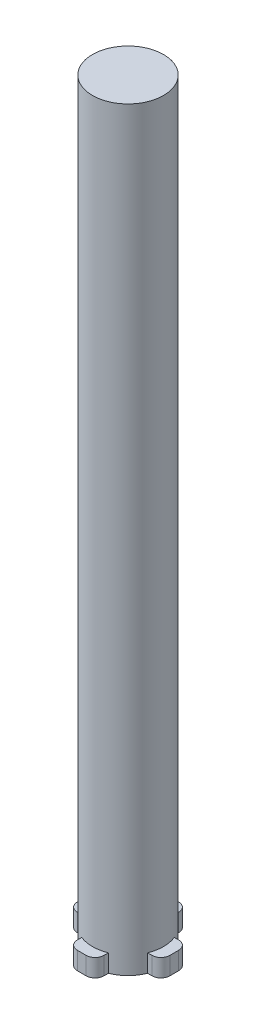
ISO-10303-21;
HEADER;
FILE_DESCRIPTION(('STEP AP214'),'2;1');
FILE_NAME('part.step','',(''),(''),'','','');
FILE_SCHEMA(('AUTOMOTIVE_DESIGN { 1 0 10303 214 1 1 1 1 }'));
ENDSEC;
DATA;
#1=APPLICATION_CONTEXT('core data for automotive mechanical design processes');
#2=APPLICATION_PROTOCOL_DEFINITION('international standard','automotive_design',2000,#1);
#3=PRODUCT_CONTEXT('',#1,'mechanical');
#4=PRODUCT('Part','Part','',(#3));
#5=PRODUCT_RELATED_PRODUCT_CATEGORY('part','',(#4));
#6=PRODUCT_DEFINITION_FORMATION('','',#4);
#7=PRODUCT_DEFINITION_CONTEXT('part definition',#1,'design');
#8=PRODUCT_DEFINITION('design','',#6,#7);
#9=PRODUCT_DEFINITION_SHAPE('','',#8);
#10=(LENGTH_UNIT() NAMED_UNIT(*) SI_UNIT(.MILLI.,.METRE.));
#11=(NAMED_UNIT(*) PLANE_ANGLE_UNIT() SI_UNIT($,.RADIAN.));
#12=(NAMED_UNIT(*) SI_UNIT($,.STERADIAN.) SOLID_ANGLE_UNIT());
#13=UNCERTAINTY_MEASURE_WITH_UNIT(LENGTH_MEASURE(1.E-05),#10,'distance_accuracy_value','');
#14=(GEOMETRIC_REPRESENTATION_CONTEXT(3) GLOBAL_UNCERTAINTY_ASSIGNED_CONTEXT((#13)) GLOBAL_UNIT_ASSIGNED_CONTEXT((#10,
#11,#12)) REPRESENTATION_CONTEXT('',''));
#15=CARTESIAN_POINT('',(0.,0.,0.));
#16=DIRECTION('',(0.,0.,1.));
#17=DIRECTION('',(1.,0.,0.));
#18=AXIS2_PLACEMENT_3D('',#15,#16,#17);
#19=CARTESIAN_POINT('',(0.,85.,0.));
#20=DIRECTION('',(0.,-1.,0.));
#21=DIRECTION('',(0.,0.,-1.));
#22=AXIS2_PLACEMENT_3D('',#19,#20,#21);
#23=CYLINDRICAL_SURFACE('',#22,4.);
#24=CARTESIAN_POINT('',(0.,85.,0.));
#25=DIRECTION('',(0.,1.,0.));
#26=DIRECTION('',(0.,0.,1.));
#27=AXIS2_PLACEMENT_3D('',#24,#25,#26);
#28=CIRCLE('',#27,4.);
#29=CARTESIAN_POINT('',(0.,85.,4.));
#30=VERTEX_POINT('',#29);
#31=EDGE_CURVE('E334',#30,#30,#28,.T.);
#32=ORIENTED_EDGE('',*,*,#31,.F.);
#33=EDGE_LOOP('',(#32));
#34=FACE_BOUND('',#33,.T.);
#35=DIRECTION('',(0.,-1.,0.));
#36=VECTOR('',#35,1.);
#37=CARTESIAN_POINT('',(-3.70809924354782,2.,1.50000000000004));
#38=LINE('',#37,#36);
#39=CARTESIAN_POINT('',(-3.70809924354782,2.,1.50000000000004));
#40=VERTEX_POINT('',#39);
#41=CARTESIAN_POINT('',(-3.70809924354782,0.,1.50000000000004));
#42=VERTEX_POINT('',#41);
#43=EDGE_CURVE('E207',#40,#42,#38,.T.);
#44=ORIENTED_EDGE('',*,*,#43,.T.);
#45=CARTESIAN_POINT('',(0.,0.,0.));
#46=DIRECTION('',(0.,1.,0.));
#47=DIRECTION('',(0.,0.,1.));
#48=AXIS2_PLACEMENT_3D('',#45,#46,#47);
#49=CIRCLE('',#48,4.);
#50=CARTESIAN_POINT('',(-1.5,0.,3.70809924354783));
#51=VERTEX_POINT('',#50);
#52=EDGE_CURVE('E215',#42,#51,#49,.T.);
#53=ORIENTED_EDGE('',*,*,#52,.T.);
#54=DIRECTION('',(0.,-1.,0.));
#55=VECTOR('',#54,1.);
#56=CARTESIAN_POINT('',(-1.5,2.,3.70809924354783));
#57=LINE('',#56,#55);
#58=CARTESIAN_POINT('',(-1.5,2.,3.70809924354783));
#59=VERTEX_POINT('',#58);
#60=EDGE_CURVE('E320',#59,#51,#57,.T.);
#61=ORIENTED_EDGE('',*,*,#60,.F.);
#62=CARTESIAN_POINT('',(0.,2.,0.));
#63=DIRECTION('',(0.,-1.,0.));
#64=DIRECTION('',(0.,0.,-1.));
#65=AXIS2_PLACEMENT_3D('',#62,#63,#64);
#66=CIRCLE('',#65,4.);
#67=CARTESIAN_POINT('',(1.5,2.,3.70809924354783));
#68=VERTEX_POINT('',#67);
#69=EDGE_CURVE('E313',#68,#59,#66,.T.);
#70=ORIENTED_EDGE('',*,*,#69,.F.);
#71=DIRECTION('',(0.,-1.,0.));
#72=VECTOR('',#71,1.);
#73=CARTESIAN_POINT('',(1.5,2.,3.70809924354783));
#74=LINE('',#73,#72);
#75=CARTESIAN_POINT('',(1.5,0.,3.70809924354783));
#76=VERTEX_POINT('',#75);
#77=EDGE_CURVE('E225',#68,#76,#74,.T.);
#78=ORIENTED_EDGE('',*,*,#77,.T.);
#79=CARTESIAN_POINT('',(3.70809924354784,0.,1.49999999999999));
#80=VERTEX_POINT('',#79);
#81=EDGE_CURVE('E227',#76,#80,#49,.T.);
#82=ORIENTED_EDGE('',*,*,#81,.T.);
#83=DIRECTION('',(0.,-1.,0.));
#84=VECTOR('',#83,1.);
#85=CARTESIAN_POINT('',(3.70809924354784,2.,1.49999999999999));
#86=LINE('',#85,#84);
#87=CARTESIAN_POINT('',(3.70809924354784,2.,1.49999999999999));
#88=VERTEX_POINT('',#87);
#89=EDGE_CURVE('E289',#88,#80,#86,.T.);
#90=ORIENTED_EDGE('',*,*,#89,.F.);
#91=CARTESIAN_POINT('',(0.,2.,0.));
#92=DIRECTION('',(0.,-1.,0.));
#93=DIRECTION('',(-1.,0.,0.));
#94=AXIS2_PLACEMENT_3D('',#91,#92,#93);
#95=CIRCLE('',#94,4.);
#96=CARTESIAN_POINT('',(3.70809924354783,2.,-1.50000000000001));
#97=VERTEX_POINT('',#96);
#98=EDGE_CURVE('E282',#97,#88,#95,.T.);
#99=ORIENTED_EDGE('',*,*,#98,.F.);
#100=DIRECTION('',(0.,-1.,0.));
#101=VECTOR('',#100,1.);
#102=CARTESIAN_POINT('',(3.70809924354783,2.,-1.50000000000001));
#103=LINE('',#102,#101);
#104=CARTESIAN_POINT('',(3.70809924354783,0.,-1.50000000000001));
#105=VERTEX_POINT('',#104);
#106=EDGE_CURVE('E301',#97,#105,#103,.T.);
#107=ORIENTED_EDGE('',*,*,#106,.T.);
#108=CARTESIAN_POINT('',(1.5,0.,-3.70809924354783));
#109=VERTEX_POINT('',#108);
#110=EDGE_CURVE('E341',#105,#109,#49,.T.);
#111=ORIENTED_EDGE('',*,*,#110,.T.);
#112=DIRECTION('',(0.,-1.,0.));
#113=VECTOR('',#112,1.);
#114=CARTESIAN_POINT('',(1.5,2.,-3.70809924354783));
#115=LINE('',#114,#113);
#116=CARTESIAN_POINT('',(1.5,2.,-3.70809924354783));
#117=VERTEX_POINT('',#116);
#118=EDGE_CURVE('E260',#117,#109,#115,.T.);
#119=ORIENTED_EDGE('',*,*,#118,.F.);
#120=CARTESIAN_POINT('',(0.,2.,0.));
#121=DIRECTION('',(0.,-1.,0.));
#122=DIRECTION('',(0.,0.,1.));
#123=AXIS2_PLACEMENT_3D('',#120,#121,#122);
#124=CIRCLE('',#123,4.);
#125=CARTESIAN_POINT('',(-1.5,2.,-3.70809924354783));
#126=VERTEX_POINT('',#125);
#127=EDGE_CURVE('E254',#126,#117,#124,.T.);
#128=ORIENTED_EDGE('',*,*,#127,.F.);
#129=DIRECTION('',(0.,-1.,0.));
#130=VECTOR('',#129,1.);
#131=CARTESIAN_POINT('',(-1.5,2.,-3.70809924354783));
#132=LINE('',#131,#130);
#133=CARTESIAN_POINT('',(-1.5,0.,-3.70809924354783));
#134=VERTEX_POINT('',#133);
#135=EDGE_CURVE('E269',#126,#134,#132,.T.);
#136=ORIENTED_EDGE('',*,*,#135,.T.);
#137=CARTESIAN_POINT('',(-3.70809924354785,0.,-1.49999999999996));
#138=VERTEX_POINT('',#137);
#139=EDGE_CURVE('E224',#134,#138,#49,.T.);
#140=ORIENTED_EDGE('',*,*,#139,.T.);
#141=DIRECTION('',(0.,-1.,0.));
#142=VECTOR('',#141,1.);
#143=CARTESIAN_POINT('',(-3.70809924354785,2.,-1.49999999999996));
#144=LINE('',#143,#142);
#145=CARTESIAN_POINT('',(-3.70809924354785,2.,-1.49999999999996));
#146=VERTEX_POINT('',#145);
#147=EDGE_CURVE('E234',#146,#138,#144,.T.);
#148=ORIENTED_EDGE('',*,*,#147,.F.);
#149=CARTESIAN_POINT('',(0.,2.,0.));
#150=DIRECTION('',(0.,-1.,0.));
#151=DIRECTION('',(1.,0.,0.));
#152=AXIS2_PLACEMENT_3D('',#149,#150,#151);
#153=CIRCLE('',#152,4.);
#154=EDGE_CURVE('E231',#40,#146,#153,.T.);
#155=ORIENTED_EDGE('',*,*,#154,.F.);
#156=EDGE_LOOP('',(#44,#53,#61,#70,#78,#82,#90,#99,#107,#111,#119,#128,#136,#140,#148,#155));
#157=FACE_BOUND('',#156,.T.);
#158=ADVANCED_FACE('F39',(#34,#157),#23,.T.);
#159=CARTESIAN_POINT('',(0.,85.,0.));
#160=DIRECTION('',(0.,1.,0.));
#161=DIRECTION('',(0.,0.,1.));
#162=AXIS2_PLACEMENT_3D('',#159,#160,#161);
#163=PLANE('',#162);
#164=ORIENTED_EDGE('',*,*,#31,.T.);
#165=EDGE_LOOP('',(#164));
#166=FACE_BOUND('',#165,.T.);
#167=ADVANCED_FACE('F469',(#166),#163,.T.);
#168=CARTESIAN_POINT('',(0.,0.,0.));
#169=DIRECTION('',(0.,1.,0.));
#170=DIRECTION('',(0.,0.,1.));
#171=AXIS2_PLACEMENT_3D('',#168,#169,#170);
#172=PLANE('',#171);
#173=DIRECTION('',(0.,0.,1.));
#174=VECTOR('',#173,1.);
#175=CARTESIAN_POINT('',(-5.20809924354785,0.,-1.49999999999995));
#176=LINE('',#175,#174);
#177=CARTESIAN_POINT('',(-5.20809924354784,0.,-0.499999999999945));
#178=VERTEX_POINT('',#177);
#179=CARTESIAN_POINT('',(-5.20809924354783,0.,0.500000000000055));
#180=VERTEX_POINT('',#179);
#181=EDGE_CURVE('E212',#178,#180,#176,.T.);
#182=ORIENTED_EDGE('',*,*,#181,.F.);
#183=CARTESIAN_POINT('',(-4.20809924354784,0.,-0.499999999999956));
#184=DIRECTION('',(0.,1.,0.));
#185=DIRECTION('',(0.,0.,1.));
#186=AXIS2_PLACEMENT_3D('',#183,#184,#185);
#187=CIRCLE('',#186,1.);
#188=CARTESIAN_POINT('',(-4.20809924354785,0.,-1.49999999999996));
#189=VERTEX_POINT('',#188);
#190=EDGE_CURVE('E429',#178,#189,#187,.F.);
#191=ORIENTED_EDGE('',*,*,#190,.T.);
#192=DIRECTION('',(1.,0.,0.));
#193=VECTOR('',#192,1.);
#194=CARTESIAN_POINT('',(-5.20809924354785,0.,-1.49999999999995));
#195=LINE('',#194,#193);
#196=EDGE_CURVE('E211',#189,#138,#195,.T.);
#197=ORIENTED_EDGE('',*,*,#196,.T.);
#198=ORIENTED_EDGE('',*,*,#139,.F.);
#199=DIRECTION('',(0.,0.,1.));
#200=VECTOR('',#199,1.);
#201=CARTESIAN_POINT('',(-1.5,0.,-5.20809924354783));
#202=LINE('',#201,#200);
#203=CARTESIAN_POINT('',(-1.5,0.,-4.20809924354783));
#204=VERTEX_POINT('',#203);
#205=EDGE_CURVE('E239',#204,#134,#202,.T.);
#206=ORIENTED_EDGE('',*,*,#205,.F.);
#207=CARTESIAN_POINT('',(-0.5,0.,-4.20809924354783));
#208=DIRECTION('',(0.,1.,0.));
#209=DIRECTION('',(0.,0.,1.));
#210=AXIS2_PLACEMENT_3D('',#207,#208,#209);
#211=CIRCLE('',#210,1.);
#212=CARTESIAN_POINT('',(-0.5,0.,-5.20809924354783));
#213=VERTEX_POINT('',#212);
#214=EDGE_CURVE('E400',#204,#213,#211,.F.);
#215=ORIENTED_EDGE('',*,*,#214,.T.);
#216=DIRECTION('',(-1.,0.,0.));
#217=VECTOR('',#216,1.);
#218=CARTESIAN_POINT('',(1.5,0.,-5.20809924354783));
#219=LINE('',#218,#217);
#220=CARTESIAN_POINT('',(0.5,0.,-5.20809924354783));
#221=VERTEX_POINT('',#220);
#222=EDGE_CURVE('E233',#221,#213,#219,.T.);
#223=ORIENTED_EDGE('',*,*,#222,.F.);
#224=CARTESIAN_POINT('',(0.5,0.,-4.20809924354783));
#225=DIRECTION('',(0.,1.,0.));
#226=DIRECTION('',(0.,0.,1.));
#227=AXIS2_PLACEMENT_3D('',#224,#225,#226);
#228=CIRCLE('',#227,1.);
#229=CARTESIAN_POINT('',(1.5,0.,-4.20809924354783));
#230=VERTEX_POINT('',#229);
#231=EDGE_CURVE('E403',#221,#230,#228,.F.);
#232=ORIENTED_EDGE('',*,*,#231,.T.);
#233=DIRECTION('',(0.,0.,1.));
#234=VECTOR('',#233,1.);
#235=CARTESIAN_POINT('',(1.5,0.,-5.20809924354783));
#236=LINE('',#235,#234);
#237=EDGE_CURVE('E251',#230,#109,#236,.T.);
#238=ORIENTED_EDGE('',*,*,#237,.T.);
#239=ORIENTED_EDGE('',*,*,#110,.F.);
#240=DIRECTION('',(-1.,0.,0.));
#241=VECTOR('',#240,1.);
#242=CARTESIAN_POINT('',(5.20809924354783,0.,-1.50000000000002));
#243=LINE('',#242,#241);
#244=CARTESIAN_POINT('',(4.20809924354783,0.,-1.50000000000002));
#245=VERTEX_POINT('',#244);
#246=EDGE_CURVE('E293',#245,#105,#243,.T.);
#247=ORIENTED_EDGE('',*,*,#246,.F.);
#248=CARTESIAN_POINT('',(4.20809924354783,0.,-0.500000000000015));
#249=DIRECTION('',(0.,1.,0.));
#250=DIRECTION('',(0.,0.,1.));
#251=AXIS2_PLACEMENT_3D('',#248,#249,#250);
#252=CIRCLE('',#251,1.);
#253=CARTESIAN_POINT('',(5.20809924354783,0.,-0.500000000000019));
#254=VERTEX_POINT('',#253);
#255=EDGE_CURVE('E374',#245,#254,#252,.F.);
#256=ORIENTED_EDGE('',*,*,#255,.T.);
#257=DIRECTION('',(0.,0.,-1.));
#258=VECTOR('',#257,1.);
#259=CARTESIAN_POINT('',(5.20809924354784,0.,1.49999999999998));
#260=LINE('',#259,#258);
#261=CARTESIAN_POINT('',(5.20809924354783,0.,0.499999999999982));
#262=VERTEX_POINT('',#261);
#263=EDGE_CURVE('E273',#262,#254,#260,.T.);
#264=ORIENTED_EDGE('',*,*,#263,.F.);
#265=CARTESIAN_POINT('',(4.20809924354783,0.,0.499999999999985));
#266=DIRECTION('',(0.,1.,0.));
#267=DIRECTION('',(0.,0.,1.));
#268=AXIS2_PLACEMENT_3D('',#265,#266,#267);
#269=CIRCLE('',#268,1.);
#270=CARTESIAN_POINT('',(4.20809924354784,0.,1.49999999999999));
#271=VERTEX_POINT('',#270);
#272=EDGE_CURVE('E377',#262,#271,#269,.F.);
#273=ORIENTED_EDGE('',*,*,#272,.T.);
#274=DIRECTION('',(-1.,0.,0.));
#275=VECTOR('',#274,1.);
#276=CARTESIAN_POINT('',(5.20809924354784,0.,1.49999999999998));
#277=LINE('',#276,#275);
#278=EDGE_CURVE('E279',#271,#80,#277,.T.);
#279=ORIENTED_EDGE('',*,*,#278,.T.);
#280=ORIENTED_EDGE('',*,*,#81,.F.);
#281=DIRECTION('',(0.,0.,-1.));
#282=VECTOR('',#281,1.);
#283=CARTESIAN_POINT('',(1.5,0.,5.20809924354783));
#284=LINE('',#283,#282);
#285=CARTESIAN_POINT('',(1.5,0.,4.20809924354783));
#286=VERTEX_POINT('',#285);
#287=EDGE_CURVE('E324',#286,#76,#284,.T.);
#288=ORIENTED_EDGE('',*,*,#287,.F.);
#289=CARTESIAN_POINT('',(0.5,0.,4.20809924354783));
#290=DIRECTION('',(0.,1.,0.));
#291=DIRECTION('',(0.,0.,1.));
#292=AXIS2_PLACEMENT_3D('',#289,#290,#291);
#293=CIRCLE('',#292,1.);
#294=CARTESIAN_POINT('',(0.5,0.,5.20809924354783));
#295=VERTEX_POINT('',#294);
#296=EDGE_CURVE('E348',#286,#295,#293,.F.);
#297=ORIENTED_EDGE('',*,*,#296,.T.);
#298=DIRECTION('',(1.,0.,0.));
#299=VECTOR('',#298,1.);
#300=CARTESIAN_POINT('',(-1.5,0.,5.20809924354783));
#301=LINE('',#300,#299);
#302=CARTESIAN_POINT('',(-0.5,0.,5.20809924354783));
#303=VERTEX_POINT('',#302);
#304=EDGE_CURVE('E305',#303,#295,#301,.T.);
#305=ORIENTED_EDGE('',*,*,#304,.F.);
#306=CARTESIAN_POINT('',(-0.5,0.,4.20809924354783));
#307=DIRECTION('',(0.,1.,0.));
#308=DIRECTION('',(0.,0.,1.));
#309=AXIS2_PLACEMENT_3D('',#306,#307,#308);
#310=CIRCLE('',#309,1.);
#311=CARTESIAN_POINT('',(-1.5,0.,4.20809924354783));
#312=VERTEX_POINT('',#311);
#313=EDGE_CURVE('E351',#303,#312,#310,.F.);
#314=ORIENTED_EDGE('',*,*,#313,.T.);
#315=DIRECTION('',(0.,0.,-1.));
#316=VECTOR('',#315,1.);
#317=CARTESIAN_POINT('',(-1.5,0.,5.20809924354783));
#318=LINE('',#317,#316);
#319=EDGE_CURVE('E219',#312,#51,#318,.T.);
#320=ORIENTED_EDGE('',*,*,#319,.T.);
#321=ORIENTED_EDGE('',*,*,#52,.F.);
#322=DIRECTION('',(1.,0.,0.));
#323=VECTOR('',#322,1.);
#324=CARTESIAN_POINT('',(-5.20809924354782,0.,1.50000000000005));
#325=LINE('',#324,#323);
#326=CARTESIAN_POINT('',(-4.20809924354782,0.,1.50000000000004));
#327=VERTEX_POINT('',#326);
#328=EDGE_CURVE('E203',#327,#42,#325,.T.);
#329=ORIENTED_EDGE('',*,*,#328,.F.);
#330=CARTESIAN_POINT('',(-4.20809924354783,0.,0.500000000000044));
#331=DIRECTION('',(0.,1.,0.));
#332=DIRECTION('',(0.,0.,1.));
#333=AXIS2_PLACEMENT_3D('',#330,#331,#332);
#334=CIRCLE('',#333,1.);
#335=EDGE_CURVE('E426',#327,#180,#334,.F.);
#336=ORIENTED_EDGE('',*,*,#335,.T.);
#337=EDGE_LOOP('',(#182,#191,#197,#198,#206,#215,#223,#232,#238,#239,#247,#256,#264,#273,#279,
#280,#288,#297,#305,#314,#320,#321,#329,#336));
#338=FACE_BOUND('',#337,.T.);
#339=ADVANCED_FACE('F217',(#338),#172,.F.);
#340=CARTESIAN_POINT('',(-1.5,2.,5.20809924354783));
#341=DIRECTION('',(0.,0.,-1.));
#342=DIRECTION('',(-1.,0.,0.));
#343=AXIS2_PLACEMENT_3D('',#340,#341,#342);
#344=PLANE('',#343);
#345=DIRECTION('',(1.,0.,0.));
#346=VECTOR('',#345,1.);
#347=CARTESIAN_POINT('',(-1.5,2.,5.20809924354783));
#348=LINE('',#347,#346);
#349=CARTESIAN_POINT('',(-0.5,2.,5.20809924354783));
#350=VERTEX_POINT('',#349);
#351=CARTESIAN_POINT('',(0.5,2.,5.20809924354783));
#352=VERTEX_POINT('',#351);
#353=EDGE_CURVE('E306',#350,#352,#348,.T.);
#354=ORIENTED_EDGE('',*,*,#353,.F.);
#355=DIRECTION('',(0.,-1.,0.));
#356=VECTOR('',#355,1.);
#357=CARTESIAN_POINT('',(-0.5,0.,5.20809924354783));
#358=LINE('',#357,#356);
#359=EDGE_CURVE('E344',#350,#303,#358,.T.);
#360=ORIENTED_EDGE('',*,*,#359,.T.);
#361=ORIENTED_EDGE('',*,*,#304,.T.);
#362=DIRECTION('',(0.,-1.,0.));
#363=VECTOR('',#362,1.);
#364=CARTESIAN_POINT('',(0.5,2.,5.20809924354783));
#365=LINE('',#364,#363);
#366=EDGE_CURVE('E337',#295,#352,#365,.F.);
#367=ORIENTED_EDGE('',*,*,#366,.T.);
#368=EDGE_LOOP('',(#354,#360,#361,#367));
#369=FACE_BOUND('',#368,.T.);
#370=ADVANCED_FACE('F573',(#369),#344,.F.);
#371=CARTESIAN_POINT('',(1.5,2.,5.20809924354783));
#372=DIRECTION('',(-1.,0.,0.));
#373=DIRECTION('',(0.,0.,1.));
#374=AXIS2_PLACEMENT_3D('',#371,#372,#373);
#375=PLANE('',#374);
#376=DIRECTION('',(0.,0.,-1.));
#377=VECTOR('',#376,1.);
#378=CARTESIAN_POINT('',(1.5,2.,5.20809924354783));
#379=LINE('',#378,#377);
#380=CARTESIAN_POINT('',(1.5,2.,4.20809924354783));
#381=VERTEX_POINT('',#380);
#382=EDGE_CURVE('E310',#381,#68,#379,.T.);
#383=ORIENTED_EDGE('',*,*,#382,.F.);
#384=DIRECTION('',(0.,-1.,0.));
#385=VECTOR('',#384,1.);
#386=CARTESIAN_POINT('',(1.5,2.,4.20809924354783));
#387=LINE('',#386,#385);
#388=EDGE_CURVE('E363',#381,#286,#387,.T.);
#389=ORIENTED_EDGE('',*,*,#388,.T.);
#390=ORIENTED_EDGE('',*,*,#287,.T.);
#391=ORIENTED_EDGE('',*,*,#77,.F.);
#392=EDGE_LOOP('',(#383,#389,#390,#391));
#393=FACE_BOUND('',#392,.T.);
#394=ADVANCED_FACE('F569',(#393),#375,.F.);
#395=CARTESIAN_POINT('',(-1.5,2.,5.20809924354783));
#396=DIRECTION('',(-1.,0.,0.));
#397=DIRECTION('',(0.,0.,1.));
#398=AXIS2_PLACEMENT_3D('',#395,#396,#397);
#399=PLANE('',#398);
#400=ORIENTED_EDGE('',*,*,#319,.F.);
#401=DIRECTION('',(0.,-1.,0.));
#402=VECTOR('',#401,1.);
#403=CARTESIAN_POINT('',(-1.5,2.,4.20809924354783));
#404=LINE('',#403,#402);
#405=CARTESIAN_POINT('',(-1.5,2.,4.20809924354783));
#406=VERTEX_POINT('',#405);
#407=EDGE_CURVE('E354',#312,#406,#404,.F.);
#408=ORIENTED_EDGE('',*,*,#407,.T.);
#409=DIRECTION('',(0.,0.,-1.));
#410=VECTOR('',#409,1.);
#411=CARTESIAN_POINT('',(-1.5,2.,5.20809924354783));
#412=LINE('',#411,#410);
#413=EDGE_CURVE('E317',#406,#59,#412,.T.);
#414=ORIENTED_EDGE('',*,*,#413,.T.);
#415=ORIENTED_EDGE('',*,*,#60,.T.);
#416=EDGE_LOOP('',(#400,#408,#414,#415));
#417=FACE_BOUND('',#416,.T.);
#418=ADVANCED_FACE('F565',(#417),#399,.T.);
#419=CARTESIAN_POINT('',(0.,2.,0.));
#420=DIRECTION('',(0.,-1.,0.));
#421=DIRECTION('',(0.,0.,-1.));
#422=AXIS2_PLACEMENT_3D('',#419,#420,#421);
#423=PLANE('',#422);
#424=ORIENTED_EDGE('',*,*,#413,.F.);
#425=CARTESIAN_POINT('',(-0.5,2.,4.20809924354783));
#426=DIRECTION('',(0.,-1.,0.));
#427=DIRECTION('',(0.,0.,-1.));
#428=AXIS2_PLACEMENT_3D('',#425,#426,#427);
#429=CIRCLE('',#428,1.);
#430=EDGE_CURVE('E360',#406,#350,#429,.F.);
#431=ORIENTED_EDGE('',*,*,#430,.T.);
#432=ORIENTED_EDGE('',*,*,#353,.T.);
#433=CARTESIAN_POINT('',(0.5,2.,4.20809924354783));
#434=DIRECTION('',(0.,-1.,0.));
#435=DIRECTION('',(0.,0.,-1.));
#436=AXIS2_PLACEMENT_3D('',#433,#434,#435);
#437=CIRCLE('',#436,1.);
#438=EDGE_CURVE('E357',#352,#381,#437,.F.);
#439=ORIENTED_EDGE('',*,*,#438,.T.);
#440=ORIENTED_EDGE('',*,*,#382,.T.);
#441=ORIENTED_EDGE('',*,*,#69,.T.);
#442=EDGE_LOOP('',(#424,#431,#432,#439,#440,#441));
#443=FACE_BOUND('',#442,.T.);
#444=ADVANCED_FACE('F484',(#443),#423,.F.);
#445=CARTESIAN_POINT('',(-0.5,2.,4.20809924354783));
#446=DIRECTION('',(0.,1.,0.));
#447=DIRECTION('',(0.,0.,1.));
#448=AXIS2_PLACEMENT_3D('',#445,#446,#447);
#449=CYLINDRICAL_SURFACE('',#448,1.);
#450=ORIENTED_EDGE('',*,*,#430,.F.);
#451=ORIENTED_EDGE('',*,*,#407,.F.);
#452=ORIENTED_EDGE('',*,*,#313,.F.);
#453=ORIENTED_EDGE('',*,*,#359,.F.);
#454=EDGE_LOOP('',(#450,#451,#452,#453));
#455=FACE_BOUND('',#454,.T.);
#456=ADVANCED_FACE('F480',(#455),#449,.T.);
#457=CARTESIAN_POINT('',(0.5,2.,4.20809924354783));
#458=DIRECTION('',(0.,-1.,0.));
#459=DIRECTION('',(0.,0.,-1.));
#460=AXIS2_PLACEMENT_3D('',#457,#458,#459);
#461=CYLINDRICAL_SURFACE('',#460,1.);
#462=ORIENTED_EDGE('',*,*,#438,.F.);
#463=ORIENTED_EDGE('',*,*,#366,.F.);
#464=ORIENTED_EDGE('',*,*,#296,.F.);
#465=ORIENTED_EDGE('',*,*,#388,.F.);
#466=EDGE_LOOP('',(#462,#463,#464,#465));
#467=FACE_BOUND('',#466,.T.);
#468=ADVANCED_FACE('F483',(#467),#461,.T.);
#469=CARTESIAN_POINT('',(5.20809924354784,2.,1.49999999999998));
#470=DIRECTION('',(-1.,0.,0.));
#471=DIRECTION('',(0.,0.,1.));
#472=AXIS2_PLACEMENT_3D('',#469,#470,#471);
#473=PLANE('',#472);
#474=DIRECTION('',(0.,0.,-1.));
#475=VECTOR('',#474,1.);
#476=CARTESIAN_POINT('',(5.20809924354784,2.,1.49999999999998));
#477=LINE('',#476,#475);
#478=CARTESIAN_POINT('',(5.20809924354783,2.,0.499999999999982));
#479=VERTEX_POINT('',#478);
#480=CARTESIAN_POINT('',(5.20809924354783,2.,-0.500000000000019));
#481=VERTEX_POINT('',#480);
#482=EDGE_CURVE('E274',#479,#481,#477,.T.);
#483=ORIENTED_EDGE('',*,*,#482,.F.);
#484=DIRECTION('',(0.,-1.,0.));
#485=VECTOR('',#484,1.);
#486=CARTESIAN_POINT('',(5.20809924354783,0.,0.499999999999982));
#487=LINE('',#486,#485);
#488=EDGE_CURVE('E370',#479,#262,#487,.T.);
#489=ORIENTED_EDGE('',*,*,#488,.T.);
#490=ORIENTED_EDGE('',*,*,#263,.T.);
#491=DIRECTION('',(0.,-1.,0.));
#492=VECTOR('',#491,1.);
#493=CARTESIAN_POINT('',(5.20809924354783,2.,-0.500000000000019));
#494=LINE('',#493,#492);
#495=EDGE_CURVE('E367',#254,#481,#494,.F.);
#496=ORIENTED_EDGE('',*,*,#495,.T.);
#497=EDGE_LOOP('',(#483,#489,#490,#496));
#498=FACE_BOUND('',#497,.T.);
#499=ADVANCED_FACE('F488',(#498),#473,.F.);
#500=CARTESIAN_POINT('',(5.20809924354783,2.,-1.50000000000002));
#501=DIRECTION('',(0.,0.,1.));
#502=DIRECTION('',(1.,0.,0.));
#503=AXIS2_PLACEMENT_3D('',#500,#501,#502);
#504=PLANE('',#503);
#505=DIRECTION('',(-1.,0.,0.));
#506=VECTOR('',#505,1.);
#507=CARTESIAN_POINT('',(5.20809924354783,2.,-1.50000000000002));
#508=LINE('',#507,#506);
#509=CARTESIAN_POINT('',(4.20809924354783,2.,-1.50000000000002));
#510=VERTEX_POINT('',#509);
#511=EDGE_CURVE('E278',#510,#97,#508,.T.);
#512=ORIENTED_EDGE('',*,*,#511,.F.);
#513=DIRECTION('',(0.,-1.,0.));
#514=VECTOR('',#513,1.);
#515=CARTESIAN_POINT('',(4.20809924354783,2.,-1.50000000000002));
#516=LINE('',#515,#514);
#517=EDGE_CURVE('E389',#510,#245,#516,.T.);
#518=ORIENTED_EDGE('',*,*,#517,.T.);
#519=ORIENTED_EDGE('',*,*,#246,.T.);
#520=ORIENTED_EDGE('',*,*,#106,.F.);
#521=EDGE_LOOP('',(#512,#518,#519,#520));
#522=FACE_BOUND('',#521,.T.);
#523=ADVANCED_FACE('F555',(#522),#504,.F.);
#524=CARTESIAN_POINT('',(5.20809924354784,2.,1.49999999999998));
#525=DIRECTION('',(0.,0.,1.));
#526=DIRECTION('',(1.,0.,0.));
#527=AXIS2_PLACEMENT_3D('',#524,#525,#526);
#528=PLANE('',#527);
#529=ORIENTED_EDGE('',*,*,#278,.F.);
#530=DIRECTION('',(0.,-1.,0.));
#531=VECTOR('',#530,1.);
#532=CARTESIAN_POINT('',(4.20809924354784,2.,1.49999999999999));
#533=LINE('',#532,#531);
#534=CARTESIAN_POINT('',(4.20809924354784,2.,1.49999999999999));
#535=VERTEX_POINT('',#534);
#536=EDGE_CURVE('E380',#271,#535,#533,.F.);
#537=ORIENTED_EDGE('',*,*,#536,.T.);
#538=DIRECTION('',(-1.,0.,0.));
#539=VECTOR('',#538,1.);
#540=CARTESIAN_POINT('',(5.20809924354784,2.,1.49999999999998));
#541=LINE('',#540,#539);
#542=EDGE_CURVE('E286',#535,#88,#541,.T.);
#543=ORIENTED_EDGE('',*,*,#542,.T.);
#544=ORIENTED_EDGE('',*,*,#89,.T.);
#545=EDGE_LOOP('',(#529,#537,#543,#544));
#546=FACE_BOUND('',#545,.T.);
#547=ADVANCED_FACE('F551',(#546),#528,.T.);
#548=CARTESIAN_POINT('',(0.,2.,0.));
#549=DIRECTION('',(0.,-1.,0.));
#550=DIRECTION('',(-1.,0.,0.));
#551=AXIS2_PLACEMENT_3D('',#548,#549,#550);
#552=PLANE('',#551);
#553=ORIENTED_EDGE('',*,*,#542,.F.);
#554=CARTESIAN_POINT('',(4.20809924354783,2.,0.499999999999985));
#555=DIRECTION('',(0.,-1.,0.));
#556=DIRECTION('',(0.,0.,-1.));
#557=AXIS2_PLACEMENT_3D('',#554,#555,#556);
#558=CIRCLE('',#557,1.);
#559=EDGE_CURVE('E386',#535,#479,#558,.F.);
#560=ORIENTED_EDGE('',*,*,#559,.T.);
#561=ORIENTED_EDGE('',*,*,#482,.T.);
#562=CARTESIAN_POINT('',(4.20809924354783,2.,-0.500000000000015));
#563=DIRECTION('',(0.,-1.,0.));
#564=DIRECTION('',(0.,0.,-1.));
#565=AXIS2_PLACEMENT_3D('',#562,#563,#564);
#566=CIRCLE('',#565,1.);
#567=EDGE_CURVE('E383',#481,#510,#566,.F.);
#568=ORIENTED_EDGE('',*,*,#567,.T.);
#569=ORIENTED_EDGE('',*,*,#511,.T.);
#570=ORIENTED_EDGE('',*,*,#98,.T.);
#571=EDGE_LOOP('',(#553,#560,#561,#568,#569,#570));
#572=FACE_BOUND('',#571,.T.);
#573=ADVANCED_FACE('F548',(#572),#552,.F.);
#574=CARTESIAN_POINT('',(1.5,2.,-5.20809924354783));
#575=DIRECTION('',(0.,0.,1.));
#576=DIRECTION('',(1.,0.,0.));
#577=AXIS2_PLACEMENT_3D('',#574,#575,#576);
#578=PLANE('',#577);
#579=DIRECTION('',(-1.,0.,0.));
#580=VECTOR('',#579,1.);
#581=CARTESIAN_POINT('',(1.5,2.,-5.20809924354783));
#582=LINE('',#581,#580);
#583=CARTESIAN_POINT('',(0.5,2.,-5.20809924354783));
#584=VERTEX_POINT('',#583);
#585=CARTESIAN_POINT('',(-0.5,2.,-5.20809924354783));
#586=VERTEX_POINT('',#585);
#587=EDGE_CURVE('E246',#584,#586,#582,.T.);
#588=ORIENTED_EDGE('',*,*,#587,.F.);
#589=DIRECTION('',(0.,-1.,0.));
#590=VECTOR('',#589,1.);
#591=CARTESIAN_POINT('',(0.5,0.,-5.20809924354783));
#592=LINE('',#591,#590);
#593=EDGE_CURVE('E396',#584,#221,#592,.T.);
#594=ORIENTED_EDGE('',*,*,#593,.T.);
#595=ORIENTED_EDGE('',*,*,#222,.T.);
#596=DIRECTION('',(0.,-1.,0.));
#597=VECTOR('',#596,1.);
#598=CARTESIAN_POINT('',(-0.5,2.,-5.20809924354783));
#599=LINE('',#598,#597);
#600=EDGE_CURVE('E393',#213,#586,#599,.F.);
#601=ORIENTED_EDGE('',*,*,#600,.T.);
#602=EDGE_LOOP('',(#588,#594,#595,#601));
#603=FACE_BOUND('',#602,.T.);
#604=ADVANCED_FACE('F527',(#603),#578,.F.);
#605=CARTESIAN_POINT('',(-1.5,2.,-5.20809924354783));
#606=DIRECTION('',(1.,0.,0.));
#607=DIRECTION('',(0.,0.,-1.));
#608=AXIS2_PLACEMENT_3D('',#605,#606,#607);
#609=PLANE('',#608);
#610=DIRECTION('',(0.,0.,1.));
#611=VECTOR('',#610,1.);
#612=CARTESIAN_POINT('',(-1.5,2.,-5.20809924354783));
#613=LINE('',#612,#611);
#614=CARTESIAN_POINT('',(-1.5,2.,-4.20809924354783));
#615=VERTEX_POINT('',#614);
#616=EDGE_CURVE('E250',#615,#126,#613,.T.);
#617=ORIENTED_EDGE('',*,*,#616,.F.);
#618=DIRECTION('',(0.,-1.,0.));
#619=VECTOR('',#618,1.);
#620=CARTESIAN_POINT('',(-1.5,2.,-4.20809924354783));
#621=LINE('',#620,#619);
#622=EDGE_CURVE('E415',#615,#204,#621,.T.);
#623=ORIENTED_EDGE('',*,*,#622,.T.);
#624=ORIENTED_EDGE('',*,*,#205,.T.);
#625=ORIENTED_EDGE('',*,*,#135,.F.);
#626=EDGE_LOOP('',(#617,#623,#624,#625));
#627=FACE_BOUND('',#626,.T.);
#628=ADVANCED_FACE('F517',(#627),#609,.F.);
#629=CARTESIAN_POINT('',(1.5,2.,-5.20809924354783));
#630=DIRECTION('',(1.,0.,0.));
#631=DIRECTION('',(0.,0.,-1.));
#632=AXIS2_PLACEMENT_3D('',#629,#630,#631);
#633=PLANE('',#632);
#634=ORIENTED_EDGE('',*,*,#237,.F.);
#635=DIRECTION('',(0.,-1.,0.));
#636=VECTOR('',#635,1.);
#637=CARTESIAN_POINT('',(1.5,2.,-4.20809924354783));
#638=LINE('',#637,#636);
#639=CARTESIAN_POINT('',(1.5,2.,-4.20809924354783));
#640=VERTEX_POINT('',#639);
#641=EDGE_CURVE('E406',#230,#640,#638,.F.);
#642=ORIENTED_EDGE('',*,*,#641,.T.);
#643=DIRECTION('',(0.,0.,1.));
#644=VECTOR('',#643,1.);
#645=CARTESIAN_POINT('',(1.5,2.,-5.20809924354783));
#646=LINE('',#645,#644);
#647=EDGE_CURVE('E258',#640,#117,#646,.T.);
#648=ORIENTED_EDGE('',*,*,#647,.T.);
#649=ORIENTED_EDGE('',*,*,#118,.T.);
#650=EDGE_LOOP('',(#634,#642,#648,#649));
#651=FACE_BOUND('',#650,.T.);
#652=ADVANCED_FACE('F535',(#651),#633,.T.);
#653=CARTESIAN_POINT('',(0.,2.,0.));
#654=DIRECTION('',(0.,-1.,0.));
#655=DIRECTION('',(0.,0.,1.));
#656=AXIS2_PLACEMENT_3D('',#653,#654,#655);
#657=PLANE('',#656);
#658=ORIENTED_EDGE('',*,*,#647,.F.);
#659=CARTESIAN_POINT('',(0.5,2.,-4.20809924354783));
#660=DIRECTION('',(0.,-1.,0.));
#661=DIRECTION('',(0.,0.,-1.));
#662=AXIS2_PLACEMENT_3D('',#659,#660,#661);
#663=CIRCLE('',#662,1.);
#664=EDGE_CURVE('E412',#640,#584,#663,.F.);
#665=ORIENTED_EDGE('',*,*,#664,.T.);
#666=ORIENTED_EDGE('',*,*,#587,.T.);
#667=CARTESIAN_POINT('',(-0.5,2.,-4.20809924354783));
#668=DIRECTION('',(0.,-1.,0.));
#669=DIRECTION('',(0.,0.,-1.));
#670=AXIS2_PLACEMENT_3D('',#667,#668,#669);
#671=CIRCLE('',#670,1.);
#672=EDGE_CURVE('E409',#586,#615,#671,.F.);
#673=ORIENTED_EDGE('',*,*,#672,.T.);
#674=ORIENTED_EDGE('',*,*,#616,.T.);
#675=ORIENTED_EDGE('',*,*,#127,.T.);
#676=EDGE_LOOP('',(#658,#665,#666,#673,#674,#675));
#677=FACE_BOUND('',#676,.T.);
#678=ADVANCED_FACE('F512',(#677),#657,.F.);
#679=CARTESIAN_POINT('',(-5.20809924354785,2.,-1.49999999999995));
#680=DIRECTION('',(1.,0.,0.));
#681=DIRECTION('',(0.,0.,-1.));
#682=AXIS2_PLACEMENT_3D('',#679,#680,#681);
#683=PLANE('',#682);
#684=DIRECTION('',(0.,0.,1.));
#685=VECTOR('',#684,1.);
#686=CARTESIAN_POINT('',(-5.20809924354785,2.,-1.49999999999995));
#687=LINE('',#686,#685);
#688=CARTESIAN_POINT('',(-5.20809924354784,2.,-0.499999999999945));
#689=VERTEX_POINT('',#688);
#690=CARTESIAN_POINT('',(-5.20809924354783,2.,0.500000000000055));
#691=VERTEX_POINT('',#690);
#692=EDGE_CURVE('E439',#689,#691,#687,.T.);
#693=ORIENTED_EDGE('',*,*,#692,.F.);
#694=DIRECTION('',(0.,-1.,0.));
#695=VECTOR('',#694,1.);
#696=CARTESIAN_POINT('',(-5.20809924354784,0.,-0.499999999999945));
#697=LINE('',#696,#695);
#698=EDGE_CURVE('E422',#689,#178,#697,.T.);
#699=ORIENTED_EDGE('',*,*,#698,.T.);
#700=ORIENTED_EDGE('',*,*,#181,.T.);
#701=DIRECTION('',(0.,-1.,0.));
#702=VECTOR('',#701,1.);
#703=CARTESIAN_POINT('',(-5.20809924354783,2.,0.500000000000055));
#704=LINE('',#703,#702);
#705=EDGE_CURVE('E419',#180,#691,#704,.F.);
#706=ORIENTED_EDGE('',*,*,#705,.T.);
#707=EDGE_LOOP('',(#693,#699,#700,#706));
#708=FACE_BOUND('',#707,.T.);
#709=ADVANCED_FACE('F443',(#708),#683,.F.);
#710=CARTESIAN_POINT('',(-5.20809924354782,2.,1.50000000000005));
#711=DIRECTION('',(0.,0.,-1.));
#712=DIRECTION('',(-1.,0.,0.));
#713=AXIS2_PLACEMENT_3D('',#710,#711,#712);
#714=PLANE('',#713);
#715=DIRECTION('',(1.,0.,0.));
#716=VECTOR('',#715,1.);
#717=CARTESIAN_POINT('',(-5.20809924354782,2.,1.50000000000005));
#718=LINE('',#717,#716);
#719=CARTESIAN_POINT('',(-4.20809924354782,2.,1.50000000000004));
#720=VERTEX_POINT('',#719);
#721=EDGE_CURVE('E447',#720,#40,#718,.T.);
#722=ORIENTED_EDGE('',*,*,#721,.F.);
#723=DIRECTION('',(0.,-1.,0.));
#724=VECTOR('',#723,1.);
#725=CARTESIAN_POINT('',(-4.20809924354782,2.,1.50000000000004));
#726=LINE('',#725,#724);
#727=EDGE_CURVE('E11',#720,#327,#726,.T.);
#728=ORIENTED_EDGE('',*,*,#727,.T.);
#729=ORIENTED_EDGE('',*,*,#328,.T.);
#730=ORIENTED_EDGE('',*,*,#43,.F.);
#731=EDGE_LOOP('',(#722,#728,#729,#730));
#732=FACE_BOUND('',#731,.T.);
#733=ADVANCED_FACE('F205',(#732),#714,.F.);
#734=CARTESIAN_POINT('',(-5.20809924354785,2.,-1.49999999999995));
#735=DIRECTION('',(0.,0.,-1.));
#736=DIRECTION('',(-1.,0.,0.));
#737=AXIS2_PLACEMENT_3D('',#734,#735,#736);
#738=PLANE('',#737);
#739=ORIENTED_EDGE('',*,*,#196,.F.);
#740=DIRECTION('',(0.,-1.,0.));
#741=VECTOR('',#740,1.);
#742=CARTESIAN_POINT('',(-4.20809924354785,2.,-1.49999999999996));
#743=LINE('',#742,#741);
#744=CARTESIAN_POINT('',(-4.20809924354785,2.,-1.49999999999996));
#745=VERTEX_POINT('',#744);
#746=EDGE_CURVE('E63',#189,#745,#743,.F.);
#747=ORIENTED_EDGE('',*,*,#746,.T.);
#748=DIRECTION('',(1.,0.,0.));
#749=VECTOR('',#748,1.);
#750=CARTESIAN_POINT('',(-5.20809924354785,2.,-1.49999999999995));
#751=LINE('',#750,#749);
#752=EDGE_CURVE('E242',#745,#146,#751,.T.);
#753=ORIENTED_EDGE('',*,*,#752,.T.);
#754=ORIENTED_EDGE('',*,*,#147,.T.);
#755=EDGE_LOOP('',(#739,#747,#753,#754));
#756=FACE_BOUND('',#755,.T.);
#757=ADVANCED_FACE('F452',(#756),#738,.T.);
#758=CARTESIAN_POINT('',(0.,2.,0.));
#759=DIRECTION('',(0.,-1.,0.));
#760=DIRECTION('',(1.,0.,0.));
#761=AXIS2_PLACEMENT_3D('',#758,#759,#760);
#762=PLANE('',#761);
#763=ORIENTED_EDGE('',*,*,#752,.F.);
#764=CARTESIAN_POINT('',(-4.20809924354784,2.,-0.499999999999956));
#765=DIRECTION('',(0.,-1.,0.));
#766=DIRECTION('',(0.,0.,-1.));
#767=AXIS2_PLACEMENT_3D('',#764,#765,#766);
#768=CIRCLE('',#767,1.);
#769=EDGE_CURVE('E48',#745,#689,#768,.F.);
#770=ORIENTED_EDGE('',*,*,#769,.T.);
#771=ORIENTED_EDGE('',*,*,#692,.T.);
#772=CARTESIAN_POINT('',(-4.20809924354783,2.,0.500000000000044));
#773=DIRECTION('',(0.,-1.,0.));
#774=DIRECTION('',(0.,0.,-1.));
#775=AXIS2_PLACEMENT_3D('',#772,#773,#774);
#776=CIRCLE('',#775,1.);
#777=EDGE_CURVE('E55',#691,#720,#776,.F.);
#778=ORIENTED_EDGE('',*,*,#777,.T.);
#779=ORIENTED_EDGE('',*,*,#721,.T.);
#780=ORIENTED_EDGE('',*,*,#154,.T.);
#781=EDGE_LOOP('',(#763,#770,#771,#778,#779,#780));
#782=FACE_BOUND('',#781,.T.);
#783=ADVANCED_FACE('F438',(#782),#762,.F.);
#784=CARTESIAN_POINT('',(4.20809924354783,2.,0.499999999999985));
#785=DIRECTION('',(0.,1.,0.));
#786=DIRECTION('',(0.,0.,1.));
#787=AXIS2_PLACEMENT_3D('',#784,#785,#786);
#788=CYLINDRICAL_SURFACE('',#787,1.);
#789=ORIENTED_EDGE('',*,*,#559,.F.);
#790=ORIENTED_EDGE('',*,*,#536,.F.);
#791=ORIENTED_EDGE('',*,*,#272,.F.);
#792=ORIENTED_EDGE('',*,*,#488,.F.);
#793=EDGE_LOOP('',(#789,#790,#791,#792));
#794=FACE_BOUND('',#793,.T.);
#795=ADVANCED_FACE('F490',(#794),#788,.T.);
#796=CARTESIAN_POINT('',(4.20809924354783,2.,-0.500000000000015));
#797=DIRECTION('',(0.,-1.,0.));
#798=DIRECTION('',(0.,0.,-1.));
#799=AXIS2_PLACEMENT_3D('',#796,#797,#798);
#800=CYLINDRICAL_SURFACE('',#799,1.);
#801=ORIENTED_EDGE('',*,*,#567,.F.);
#802=ORIENTED_EDGE('',*,*,#495,.F.);
#803=ORIENTED_EDGE('',*,*,#255,.F.);
#804=ORIENTED_EDGE('',*,*,#517,.F.);
#805=EDGE_LOOP('',(#801,#802,#803,#804));
#806=FACE_BOUND('',#805,.T.);
#807=ADVANCED_FACE('F493',(#806),#800,.T.);
#808=CARTESIAN_POINT('',(0.5,2.,-4.20809924354783));
#809=DIRECTION('',(0.,1.,0.));
#810=DIRECTION('',(0.,0.,1.));
#811=AXIS2_PLACEMENT_3D('',#808,#809,#810);
#812=CYLINDRICAL_SURFACE('',#811,1.);
#813=ORIENTED_EDGE('',*,*,#664,.F.);
#814=ORIENTED_EDGE('',*,*,#641,.F.);
#815=ORIENTED_EDGE('',*,*,#231,.F.);
#816=ORIENTED_EDGE('',*,*,#593,.F.);
#817=EDGE_LOOP('',(#813,#814,#815,#816));
#818=FACE_BOUND('',#817,.T.);
#819=ADVANCED_FACE('F497',(#818),#812,.T.);
#820=CARTESIAN_POINT('',(-0.5,2.,-4.20809924354783));
#821=DIRECTION('',(0.,-1.,0.));
#822=DIRECTION('',(0.,0.,-1.));
#823=AXIS2_PLACEMENT_3D('',#820,#821,#822);
#824=CYLINDRICAL_SURFACE('',#823,1.);
#825=ORIENTED_EDGE('',*,*,#672,.F.);
#826=ORIENTED_EDGE('',*,*,#600,.F.);
#827=ORIENTED_EDGE('',*,*,#214,.F.);
#828=ORIENTED_EDGE('',*,*,#622,.F.);
#829=EDGE_LOOP('',(#825,#826,#827,#828));
#830=FACE_BOUND('',#829,.T.);
#831=ADVANCED_FACE('F467',(#830),#824,.T.);
#832=CARTESIAN_POINT('',(-4.20809924354784,2.,-0.499999999999956));
#833=DIRECTION('',(0.,1.,0.));
#834=DIRECTION('',(0.,0.,1.));
#835=AXIS2_PLACEMENT_3D('',#832,#833,#834);
#836=CYLINDRICAL_SURFACE('',#835,1.);
#837=ORIENTED_EDGE('',*,*,#769,.F.);
#838=ORIENTED_EDGE('',*,*,#746,.F.);
#839=ORIENTED_EDGE('',*,*,#190,.F.);
#840=ORIENTED_EDGE('',*,*,#698,.F.);
#841=EDGE_LOOP('',(#837,#838,#839,#840));
#842=FACE_BOUND('',#841,.T.);
#843=ADVANCED_FACE('F449',(#842),#836,.T.);
#844=CARTESIAN_POINT('',(-4.20809924354783,2.,0.500000000000044));
#845=DIRECTION('',(0.,-1.,0.));
#846=DIRECTION('',(0.,0.,-1.));
#847=AXIS2_PLACEMENT_3D('',#844,#845,#846);
#848=CYLINDRICAL_SURFACE('',#847,1.);
#849=ORIENTED_EDGE('',*,*,#777,.F.);
#850=ORIENTED_EDGE('',*,*,#705,.F.);
#851=ORIENTED_EDGE('',*,*,#335,.F.);
#852=ORIENTED_EDGE('',*,*,#727,.F.);
#853=EDGE_LOOP('',(#849,#850,#851,#852));
#854=FACE_BOUND('',#853,.T.);
#855=ADVANCED_FACE('F41',(#854),#848,.T.);
#856=CLOSED_SHELL('',(#158,#167,#339,#370,#394,#418,#444,#456,#468,#499,#523,#547,#573,#604,
#628,#652,#678,#709,#733,#757,#783,#795,#807,#819,#831,#843,#855));
#857=MANIFOLD_SOLID_BREP('B2',#856);
#858=ADVANCED_BREP_SHAPE_REPRESENTATION('',(#18,#857),#14);
#859=SHAPE_DEFINITION_REPRESENTATION(#9,#858);
ENDSEC;
END-ISO-10303-21;
